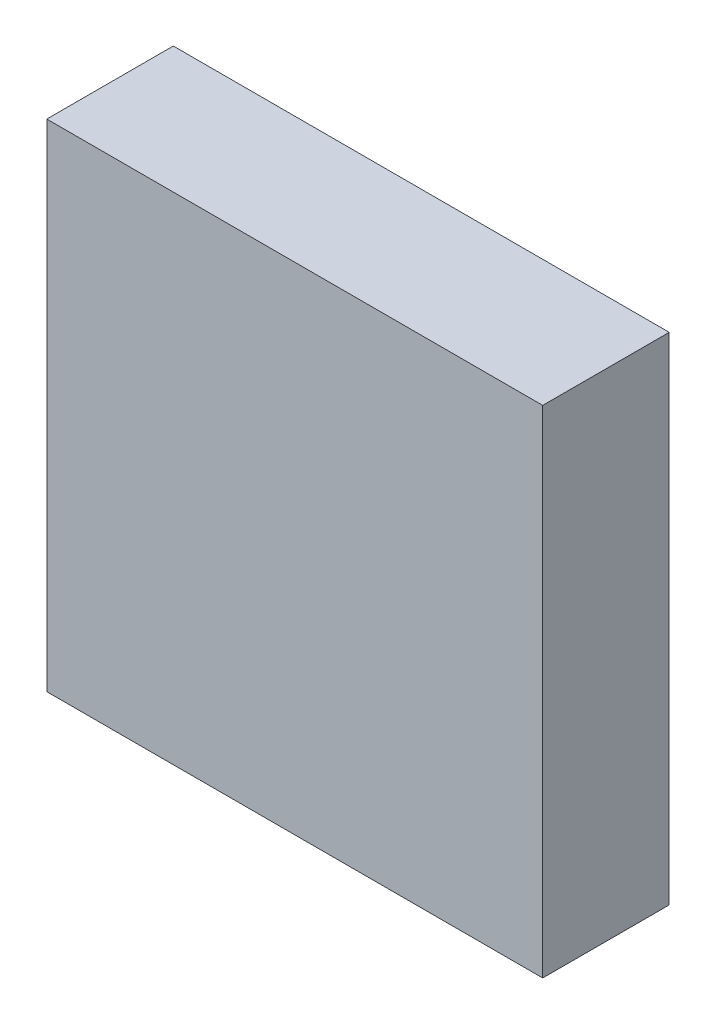
ISO-10303-21;
HEADER;
FILE_DESCRIPTION(('STEP AP214'),'2;1');
FILE_NAME('part.step','',(''),(''),'','','');
FILE_SCHEMA(('AUTOMOTIVE_DESIGN { 1 0 10303 214 1 1 1 1 }'));
ENDSEC;
DATA;
#1=APPLICATION_CONTEXT('core data for automotive mechanical design processes');
#2=APPLICATION_PROTOCOL_DEFINITION('international standard','automotive_design',2000,#1);
#3=PRODUCT_CONTEXT('',#1,'mechanical');
#4=PRODUCT('Part','Part','',(#3));
#5=PRODUCT_RELATED_PRODUCT_CATEGORY('part','',(#4));
#6=PRODUCT_DEFINITION_FORMATION('','',#4);
#7=PRODUCT_DEFINITION_CONTEXT('part definition',#1,'design');
#8=PRODUCT_DEFINITION('design','',#6,#7);
#9=PRODUCT_DEFINITION_SHAPE('','',#8);
#10=(LENGTH_UNIT() NAMED_UNIT(*) SI_UNIT(.MILLI.,.METRE.));
#11=(NAMED_UNIT(*) PLANE_ANGLE_UNIT() SI_UNIT($,.RADIAN.));
#12=(NAMED_UNIT(*) SI_UNIT($,.STERADIAN.) SOLID_ANGLE_UNIT());
#13=UNCERTAINTY_MEASURE_WITH_UNIT(LENGTH_MEASURE(1.E-05),#10,'distance_accuracy_value','');
#14=(GEOMETRIC_REPRESENTATION_CONTEXT(3) GLOBAL_UNCERTAINTY_ASSIGNED_CONTEXT((#13)) GLOBAL_UNIT_ASSIGNED_CONTEXT((#10,
#11,#12)) REPRESENTATION_CONTEXT('',''));
#15=CARTESIAN_POINT('',(0.,0.,0.));
#16=DIRECTION('',(0.,0.,1.));
#17=DIRECTION('',(1.,0.,0.));
#18=AXIS2_PLACEMENT_3D('',#15,#16,#17);
#19=CARTESIAN_POINT('',(-1.22499882,-1.22499882,0.62500002));
#20=DIRECTION('',(0.,0.,-1.));
#21=DIRECTION('',(-1.,0.,0.));
#22=AXIS2_PLACEMENT_3D('',#19,#20,#21);
#23=PLANE('',#22);
#24=DIRECTION('',(0.,1.,0.));
#25=VECTOR('',#24,1.);
#26=CARTESIAN_POINT('',(1.22499882,-1.22499882,0.62500002));
#27=LINE('',#26,#25);
#28=CARTESIAN_POINT('',(1.22499882,-1.22499882,0.62500002));
#29=VERTEX_POINT('',#28);
#30=CARTESIAN_POINT('',(1.22499882,1.22499882,0.62500002));
#31=VERTEX_POINT('',#30);
#32=EDGE_CURVE('E55',#29,#31,#27,.T.);
#33=ORIENTED_EDGE('',*,*,#32,.T.);
#34=DIRECTION('',(1.,0.,0.));
#35=VECTOR('',#34,1.);
#36=CARTESIAN_POINT('',(1.22499882,1.22499882,0.62500002));
#37=LINE('',#36,#35);
#38=CARTESIAN_POINT('',(-1.22499882,1.22499882,0.62500002));
#39=VERTEX_POINT('',#38);
#40=EDGE_CURVE('E57',#31,#39,#37,.F.);
#41=ORIENTED_EDGE('',*,*,#40,.T.);
#42=DIRECTION('',(0.,1.,0.));
#43=VECTOR('',#42,1.);
#44=CARTESIAN_POINT('',(-1.22499882,1.22499882,0.62500002));
#45=LINE('',#44,#43);
#46=CARTESIAN_POINT('',(-1.22499882,-1.22499882,0.62500002));
#47=VERTEX_POINT('',#46);
#48=EDGE_CURVE('E20',#39,#47,#45,.F.);
#49=ORIENTED_EDGE('',*,*,#48,.T.);
#50=DIRECTION('',(1.,0.,0.));
#51=VECTOR('',#50,1.);
#52=CARTESIAN_POINT('',(-1.22499882,-1.22499882,0.62500002));
#53=LINE('',#52,#51);
#54=EDGE_CURVE('E80',#47,#29,#53,.T.);
#55=ORIENTED_EDGE('',*,*,#54,.T.);
#56=EDGE_LOOP('',(#33,#41,#49,#55));
#57=FACE_BOUND('',#56,.T.);
#58=ADVANCED_FACE('F17',(#57),#23,.F.);
#59=CARTESIAN_POINT('',(-1.22499882,1.22499882,0.));
#60=DIRECTION('',(1.,0.,0.));
#61=DIRECTION('',(0.,0.,-1.));
#62=AXIS2_PLACEMENT_3D('',#59,#60,#61);
#63=PLANE('',#62);
#64=DIRECTION('',(0.,0.,1.));
#65=VECTOR('',#64,1.);
#66=CARTESIAN_POINT('',(-1.22499882,-1.22499882,0.));
#67=LINE('',#66,#65);
#68=CARTESIAN_POINT('',(-1.22499882,-1.22499882,0.));
#69=VERTEX_POINT('',#68);
#70=EDGE_CURVE('E68',#69,#47,#67,.T.);
#71=ORIENTED_EDGE('',*,*,#70,.T.);
#72=ORIENTED_EDGE('',*,*,#48,.F.);
#73=DIRECTION('',(0.,0.,-1.));
#74=VECTOR('',#73,1.);
#75=CARTESIAN_POINT('',(-1.22499882,1.22499882,0.));
#76=LINE('',#75,#74);
#77=CARTESIAN_POINT('',(-1.22499882,1.22499882,0.));
#78=VERTEX_POINT('',#77);
#79=EDGE_CURVE('E63',#39,#78,#76,.T.);
#80=ORIENTED_EDGE('',*,*,#79,.T.);
#81=DIRECTION('',(0.,1.,0.));
#82=VECTOR('',#81,1.);
#83=CARTESIAN_POINT('',(-1.22499882,-1.22499882,0.));
#84=LINE('',#83,#82);
#85=EDGE_CURVE('E83',#69,#78,#84,.T.);
#86=ORIENTED_EDGE('',*,*,#85,.F.);
#87=EDGE_LOOP('',(#71,#72,#80,#86));
#88=FACE_BOUND('',#87,.T.);
#89=ADVANCED_FACE('F65',(#88),#63,.F.);
#90=CARTESIAN_POINT('',(1.22499882,1.22499882,0.));
#91=DIRECTION('',(0.,-1.,0.));
#92=DIRECTION('',(0.,0.,-1.));
#93=AXIS2_PLACEMENT_3D('',#90,#91,#92);
#94=PLANE('',#93);
#95=ORIENTED_EDGE('',*,*,#79,.F.);
#96=ORIENTED_EDGE('',*,*,#40,.F.);
#97=DIRECTION('',(0.,0.,1.));
#98=VECTOR('',#97,1.);
#99=CARTESIAN_POINT('',(1.22499882,1.22499882,0.));
#100=LINE('',#99,#98);
#101=CARTESIAN_POINT('',(1.22499882,1.22499882,0.));
#102=VERTEX_POINT('',#101);
#103=EDGE_CURVE('E75',#31,#102,#100,.F.);
#104=ORIENTED_EDGE('',*,*,#103,.T.);
#105=DIRECTION('',(-1.,0.,0.));
#106=VECTOR('',#105,1.);
#107=CARTESIAN_POINT('',(-1.22499882,1.22499882,0.));
#108=LINE('',#107,#106);
#109=EDGE_CURVE('E72',#78,#102,#108,.F.);
#110=ORIENTED_EDGE('',*,*,#109,.F.);
#111=EDGE_LOOP('',(#95,#96,#104,#110));
#112=FACE_BOUND('',#111,.T.);
#113=ADVANCED_FACE('F70',(#112),#94,.F.);
#114=CARTESIAN_POINT('',(1.22499882,-1.22499882,0.));
#115=DIRECTION('',(-1.,0.,0.));
#116=DIRECTION('',(0.,0.,1.));
#117=AXIS2_PLACEMENT_3D('',#114,#115,#116);
#118=PLANE('',#117);
#119=ORIENTED_EDGE('',*,*,#103,.F.);
#120=ORIENTED_EDGE('',*,*,#32,.F.);
#121=DIRECTION('',(0.,0.,1.));
#122=VECTOR('',#121,1.);
#123=CARTESIAN_POINT('',(1.22499882,-1.22499882,0.));
#124=LINE('',#123,#122);
#125=CARTESIAN_POINT('',(1.22499882,-1.22499882,0.));
#126=VERTEX_POINT('',#125);
#127=EDGE_CURVE('E35',#29,#126,#124,.F.);
#128=ORIENTED_EDGE('',*,*,#127,.T.);
#129=DIRECTION('',(0.,1.,0.));
#130=VECTOR('',#129,1.);
#131=CARTESIAN_POINT('',(1.22499882,-1.22499882,0.));
#132=LINE('',#131,#130);
#133=EDGE_CURVE('E26',#102,#126,#132,.F.);
#134=ORIENTED_EDGE('',*,*,#133,.F.);
#135=EDGE_LOOP('',(#119,#120,#128,#134));
#136=FACE_BOUND('',#135,.T.);
#137=ADVANCED_FACE('F89',(#136),#118,.F.);
#138=CARTESIAN_POINT('',(-1.22499882,-1.22499882,0.));
#139=DIRECTION('',(0.,1.,0.));
#140=DIRECTION('',(0.,0.,1.));
#141=AXIS2_PLACEMENT_3D('',#138,#139,#140);
#142=PLANE('',#141);
#143=ORIENTED_EDGE('',*,*,#127,.F.);
#144=ORIENTED_EDGE('',*,*,#54,.F.);
#145=ORIENTED_EDGE('',*,*,#70,.F.);
#146=DIRECTION('',(-1.,0.,0.));
#147=VECTOR('',#146,1.);
#148=CARTESIAN_POINT('',(-1.22499882,-1.22499882,0.));
#149=LINE('',#148,#147);
#150=EDGE_CURVE('E11',#126,#69,#149,.T.);
#151=ORIENTED_EDGE('',*,*,#150,.F.);
#152=EDGE_LOOP('',(#143,#144,#145,#151));
#153=FACE_BOUND('',#152,.T.);
#154=ADVANCED_FACE('F91',(#153),#142,.F.);
#155=CARTESIAN_POINT('',(-1.22499882,-1.22499882,0.));
#156=DIRECTION('',(0.,0.,-1.));
#157=DIRECTION('',(-1.,0.,0.));
#158=AXIS2_PLACEMENT_3D('',#155,#156,#157);
#159=PLANE('',#158);
#160=ORIENTED_EDGE('',*,*,#133,.T.);
#161=ORIENTED_EDGE('',*,*,#150,.T.);
#162=ORIENTED_EDGE('',*,*,#85,.T.);
#163=ORIENTED_EDGE('',*,*,#109,.T.);
#164=EDGE_LOOP('',(#160,#161,#162,#163));
#165=FACE_BOUND('',#164,.T.);
#166=ADVANCED_FACE('F88',(#165),#159,.T.);
#167=CLOSED_SHELL('',(#58,#89,#113,#137,#154,#166));
#168=MANIFOLD_SOLID_BREP('B1',#167);
#169=ADVANCED_BREP_SHAPE_REPRESENTATION('',(#18,#168),#14);
#170=SHAPE_DEFINITION_REPRESENTATION(#9,#169);
ENDSEC;
END-ISO-10303-21;
